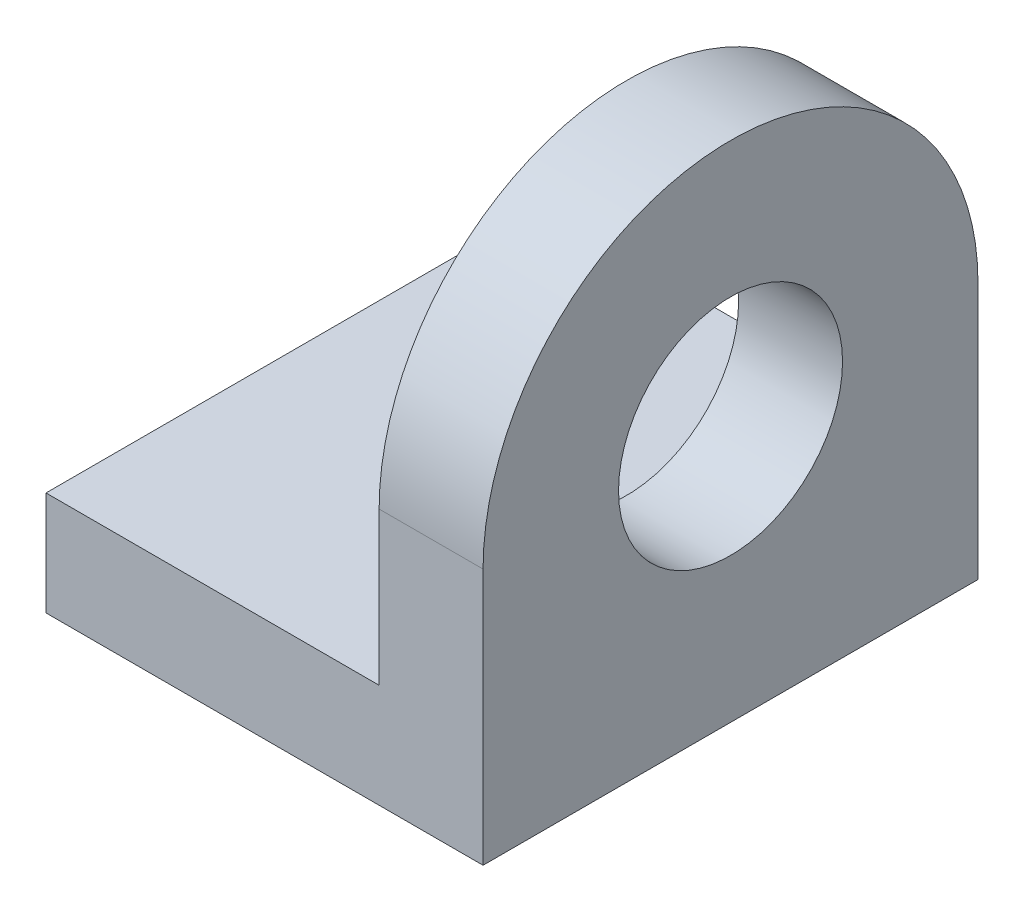
ISO-10303-21;
HEADER;
FILE_DESCRIPTION(('STEP AP214'),'2;1');
FILE_NAME('part.step','',(''),(''),'','','');
FILE_SCHEMA(('AUTOMOTIVE_DESIGN { 1 0 10303 214 1 1 1 1 }'));
ENDSEC;
DATA;
#1=APPLICATION_CONTEXT('core data for automotive mechanical design processes');
#2=APPLICATION_PROTOCOL_DEFINITION('international standard','automotive_design',2000,#1);
#3=PRODUCT_CONTEXT('',#1,'mechanical');
#4=PRODUCT('Part','Part','',(#3));
#5=PRODUCT_RELATED_PRODUCT_CATEGORY('part','',(#4));
#6=PRODUCT_DEFINITION_FORMATION('','',#4);
#7=PRODUCT_DEFINITION_CONTEXT('part definition',#1,'design');
#8=PRODUCT_DEFINITION('design','',#6,#7);
#9=PRODUCT_DEFINITION_SHAPE('','',#8);
#10=(LENGTH_UNIT() NAMED_UNIT(*) SI_UNIT(.MILLI.,.METRE.));
#11=(NAMED_UNIT(*) PLANE_ANGLE_UNIT() SI_UNIT($,.RADIAN.));
#12=(NAMED_UNIT(*) SI_UNIT($,.STERADIAN.) SOLID_ANGLE_UNIT());
#13=UNCERTAINTY_MEASURE_WITH_UNIT(LENGTH_MEASURE(1.E-05),#10,'distance_accuracy_value','');
#14=(GEOMETRIC_REPRESENTATION_CONTEXT(3) GLOBAL_UNCERTAINTY_ASSIGNED_CONTEXT((#13)) GLOBAL_UNIT_ASSIGNED_CONTEXT((#10,
#11,#12)) REPRESENTATION_CONTEXT('',''));
#15=CARTESIAN_POINT('',(0.,0.,0.));
#16=DIRECTION('',(0.,0.,1.));
#17=DIRECTION('',(1.,0.,0.));
#18=AXIS2_PLACEMENT_3D('',#15,#16,#17);
#19=CARTESIAN_POINT('',(-16.0260331578128,5.,-23.8101064058933));
#20=DIRECTION('',(1.,0.,0.));
#21=DIRECTION('',(0.,0.,-1.));
#22=AXIS2_PLACEMENT_3D('',#19,#20,#21);
#23=PLANE('',#22);
#24=DIRECTION('',(0.,0.,1.));
#25=VECTOR('',#24,1.);
#26=CARTESIAN_POINT('',(-16.0260331578128,0.,-23.8101064058933));
#27=LINE('',#26,#25);
#28=CARTESIAN_POINT('',(-16.0260331578128,0.,-23.8101064058933));
#29=VERTEX_POINT('',#28);
#30=CARTESIAN_POINT('',(-16.0260331578128,0.,0.));
#31=VERTEX_POINT('',#30);
#32=EDGE_CURVE('E99',#29,#31,#27,.T.);
#33=ORIENTED_EDGE('',*,*,#32,.T.);
#34=DIRECTION('',(0.,-1.,0.));
#35=VECTOR('',#34,1.);
#36=CARTESIAN_POINT('',(-16.0260331578128,5.,0.));
#37=LINE('',#36,#35);
#38=CARTESIAN_POINT('',(-16.0260331578128,5.,0.));
#39=VERTEX_POINT('',#38);
#40=EDGE_CURVE('E11',#39,#31,#37,.T.);
#41=ORIENTED_EDGE('',*,*,#40,.F.);
#42=DIRECTION('',(0.,0.,1.));
#43=VECTOR('',#42,1.);
#44=CARTESIAN_POINT('',(-16.0260331578128,5.,-23.8101064058933));
#45=LINE('',#44,#43);
#46=CARTESIAN_POINT('',(-16.0260331578128,5.,-23.8101064058933));
#47=VERTEX_POINT('',#46);
#48=EDGE_CURVE('E91',#47,#39,#45,.T.);
#49=ORIENTED_EDGE('',*,*,#48,.F.);
#50=DIRECTION('',(0.,-1.,0.));
#51=VECTOR('',#50,1.);
#52=CARTESIAN_POINT('',(-16.0260331578128,5.,-23.8101064058933));
#53=LINE('',#52,#51);
#54=EDGE_CURVE('E47',#47,#29,#53,.T.);
#55=ORIENTED_EDGE('',*,*,#54,.T.);
#56=EDGE_LOOP('',(#33,#41,#49,#55));
#57=FACE_BOUND('',#56,.T.);
#58=ADVANCED_FACE('F39',(#57),#23,.F.);
#59=CARTESIAN_POINT('',(-16.0260331578128,5.,0.));
#60=DIRECTION('',(0.,0.,-1.));
#61=DIRECTION('',(-1.,0.,0.));
#62=AXIS2_PLACEMENT_3D('',#59,#60,#61);
#63=PLANE('',#62);
#64=DIRECTION('',(1.,0.,0.));
#65=VECTOR('',#64,1.);
#66=CARTESIAN_POINT('',(-16.0260331578128,0.,0.));
#67=LINE('',#66,#65);
#68=CARTESIAN_POINT('',(5.,0.,0.));
#69=VERTEX_POINT('',#68);
#70=EDGE_CURVE('E68',#31,#69,#67,.T.);
#71=ORIENTED_EDGE('',*,*,#70,.T.);
#72=DIRECTION('',(0.,-1.,0.));
#73=VECTOR('',#72,1.);
#74=CARTESIAN_POINT('',(5.,0.,0.));
#75=LINE('',#74,#73);
#76=CARTESIAN_POINT('',(5.,12.3418394210588,0.));
#77=VERTEX_POINT('',#76);
#78=EDGE_CURVE('E112',#77,#69,#75,.T.);
#79=ORIENTED_EDGE('',*,*,#78,.F.);
#80=DIRECTION('',(-1.,0.,0.));
#81=VECTOR('',#80,1.);
#82=CARTESIAN_POINT('',(5.,12.3418394210588,0.));
#83=LINE('',#82,#81);
#84=CARTESIAN_POINT('',(0.,12.3418394210588,0.));
#85=VERTEX_POINT('',#84);
#86=EDGE_CURVE('E105',#77,#85,#83,.T.);
#87=ORIENTED_EDGE('',*,*,#86,.T.);
#88=DIRECTION('',(0.,-1.,0.));
#89=VECTOR('',#88,1.);
#90=CARTESIAN_POINT('',(0.,0.,0.));
#91=LINE('',#90,#89);
#92=CARTESIAN_POINT('',(0.,5.,0.));
#93=VERTEX_POINT('',#92);
#94=EDGE_CURVE('E90',#85,#93,#91,.T.);
#95=ORIENTED_EDGE('',*,*,#94,.T.);
#96=DIRECTION('',(1.,0.,0.));
#97=VECTOR('',#96,1.);
#98=CARTESIAN_POINT('',(-16.0260331578128,5.,0.));
#99=LINE('',#98,#97);
#100=EDGE_CURVE('E85',#39,#93,#99,.T.);
#101=ORIENTED_EDGE('',*,*,#100,.F.);
#102=ORIENTED_EDGE('',*,*,#40,.T.);
#103=EDGE_LOOP('',(#71,#79,#87,#95,#101,#102));
#104=FACE_BOUND('',#103,.T.);
#105=ADVANCED_FACE('F86',(#104),#63,.F.);
#106=CARTESIAN_POINT('',(-16.0260331578128,5.,-23.8101064058933));
#107=DIRECTION('',(0.,0.,1.));
#108=DIRECTION('',(1.,0.,0.));
#109=AXIS2_PLACEMENT_3D('',#106,#107,#108);
#110=PLANE('',#109);
#111=DIRECTION('',(-1.,0.,0.));
#112=VECTOR('',#111,1.);
#113=CARTESIAN_POINT('',(-16.0260331578128,0.,-23.8101064058933));
#114=LINE('',#113,#112);
#115=CARTESIAN_POINT('',(5.,0.,-23.8101064058933));
#116=VERTEX_POINT('',#115);
#117=EDGE_CURVE('E97',#116,#29,#114,.T.);
#118=ORIENTED_EDGE('',*,*,#117,.T.);
#119=ORIENTED_EDGE('',*,*,#54,.F.);
#120=DIRECTION('',(-1.,0.,0.));
#121=VECTOR('',#120,1.);
#122=CARTESIAN_POINT('',(-16.0260331578128,5.,-23.8101064058933));
#123=LINE('',#122,#121);
#124=CARTESIAN_POINT('',(0.,5.,-23.8101064058933));
#125=VERTEX_POINT('',#124);
#126=EDGE_CURVE('E55',#125,#47,#123,.T.);
#127=ORIENTED_EDGE('',*,*,#126,.F.);
#128=DIRECTION('',(0.,1.,0.));
#129=VECTOR('',#128,1.);
#130=CARTESIAN_POINT('',(0.,12.3418394210588,-23.8101064058933));
#131=LINE('',#130,#129);
#132=CARTESIAN_POINT('',(0.,12.3418394210588,-23.8101064058933));
#133=VERTEX_POINT('',#132);
#134=EDGE_CURVE('E118',#125,#133,#131,.T.);
#135=ORIENTED_EDGE('',*,*,#134,.T.);
#136=DIRECTION('',(-1.,0.,0.));
#137=VECTOR('',#136,1.);
#138=CARTESIAN_POINT('',(5.,12.3418394210588,-23.8101064058933));
#139=LINE('',#138,#137);
#140=CARTESIAN_POINT('',(5.,12.3418394210588,-23.8101064058933));
#141=VERTEX_POINT('',#140);
#142=EDGE_CURVE('E101',#141,#133,#139,.T.);
#143=ORIENTED_EDGE('',*,*,#142,.F.);
#144=DIRECTION('',(0.,1.,0.));
#145=VECTOR('',#144,1.);
#146=CARTESIAN_POINT('',(5.,12.3418394210588,-23.8101064058933));
#147=LINE('',#146,#145);
#148=EDGE_CURVE('E127',#116,#141,#147,.T.);
#149=ORIENTED_EDGE('',*,*,#148,.F.);
#150=EDGE_LOOP('',(#118,#119,#127,#135,#143,#149));
#151=FACE_BOUND('',#150,.T.);
#152=ADVANCED_FACE('F161',(#151),#110,.F.);
#153=CARTESIAN_POINT('',(0.,5.,0.));
#154=DIRECTION('',(0.,1.,0.));
#155=DIRECTION('',(0.,0.,1.));
#156=AXIS2_PLACEMENT_3D('',#153,#154,#155);
#157=PLANE('',#156);
#158=ORIENTED_EDGE('',*,*,#48,.T.);
#159=ORIENTED_EDGE('',*,*,#100,.T.);
#160=DIRECTION('',(0.,0.,-1.));
#161=VECTOR('',#160,1.);
#162=CARTESIAN_POINT('',(0.,5.,-23.8101064058933));
#163=LINE('',#162,#161);
#164=EDGE_CURVE('E75',#93,#125,#163,.T.);
#165=ORIENTED_EDGE('',*,*,#164,.T.);
#166=ORIENTED_EDGE('',*,*,#126,.T.);
#167=EDGE_LOOP('',(#158,#159,#165,#166));
#168=FACE_BOUND('',#167,.T.);
#169=ADVANCED_FACE('F94',(#168),#157,.T.);
#170=CARTESIAN_POINT('',(0.,0.,0.));
#171=DIRECTION('',(0.,1.,0.));
#172=DIRECTION('',(0.,0.,1.));
#173=AXIS2_PLACEMENT_3D('',#170,#171,#172);
#174=PLANE('',#173);
#175=ORIENTED_EDGE('',*,*,#32,.F.);
#176=ORIENTED_EDGE('',*,*,#117,.F.);
#177=DIRECTION('',(0.,0.,-1.));
#178=VECTOR('',#177,1.);
#179=CARTESIAN_POINT('',(5.,0.,-23.8101064058933));
#180=LINE('',#179,#178);
#181=EDGE_CURVE('E114',#69,#116,#180,.T.);
#182=ORIENTED_EDGE('',*,*,#181,.F.);
#183=ORIENTED_EDGE('',*,*,#70,.F.);
#184=EDGE_LOOP('',(#175,#176,#182,#183));
#185=FACE_BOUND('',#184,.T.);
#186=ADVANCED_FACE('F153',(#185),#174,.F.);
#187=CARTESIAN_POINT('',(0.,12.3418394210588,-11.9050532029466));
#188=DIRECTION('',(-1.,0.,0.));
#189=DIRECTION('',(0.,0.,1.));
#190=AXIS2_PLACEMENT_3D('',#187,#188,#189);
#191=PLANE('',#190);
#192=CARTESIAN_POINT('',(0.,12.3418394210588,-11.9050532029466));
#193=DIRECTION('',(1.,0.,0.));
#194=DIRECTION('',(0.,0.,-1.));
#195=AXIS2_PLACEMENT_3D('',#192,#193,#194);
#196=CIRCLE('',#195,5.38855883816069);
#197=CARTESIAN_POINT('',(0.,12.3418394210588,-17.2936120411073));
#198=VERTEX_POINT('',#197);
#199=EDGE_CURVE('E132',#198,#198,#196,.T.);
#200=ORIENTED_EDGE('',*,*,#199,.T.);
#201=EDGE_LOOP('',(#200));
#202=FACE_BOUND('',#201,.T.);
#203=ORIENTED_EDGE('',*,*,#164,.F.);
#204=ORIENTED_EDGE('',*,*,#94,.F.);
#205=CARTESIAN_POINT('',(0.,12.3418394210588,-11.9050532029466));
#206=DIRECTION('',(1.,0.,0.));
#207=DIRECTION('',(0.,0.,1.));
#208=AXIS2_PLACEMENT_3D('',#205,#206,#207);
#209=CIRCLE('',#208,11.9050532029466);
#210=EDGE_CURVE('E115',#133,#85,#209,.T.);
#211=ORIENTED_EDGE('',*,*,#210,.F.);
#212=ORIENTED_EDGE('',*,*,#134,.F.);
#213=EDGE_LOOP('',(#203,#204,#211,#212));
#214=FACE_BOUND('',#213,.T.);
#215=ADVANCED_FACE('F144',(#202,#214),#191,.T.);
#216=CARTESIAN_POINT('',(5.,12.3418394210588,-11.9050532029466));
#217=DIRECTION('',(-1.,0.,0.));
#218=DIRECTION('',(0.,0.,1.));
#219=AXIS2_PLACEMENT_3D('',#216,#217,#218);
#220=PLANE('',#219);
#221=ORIENTED_EDGE('',*,*,#181,.T.);
#222=ORIENTED_EDGE('',*,*,#148,.T.);
#223=CARTESIAN_POINT('',(5.,12.3418394210588,-11.9050532029466));
#224=DIRECTION('',(1.,0.,0.));
#225=DIRECTION('',(0.,0.,1.));
#226=AXIS2_PLACEMENT_3D('',#223,#224,#225);
#227=CIRCLE('',#226,11.9050532029466);
#228=EDGE_CURVE('E124',#141,#77,#227,.T.);
#229=ORIENTED_EDGE('',*,*,#228,.T.);
#230=ORIENTED_EDGE('',*,*,#78,.T.);
#231=EDGE_LOOP('',(#221,#222,#229,#230));
#232=FACE_BOUND('',#231,.T.);
#233=CARTESIAN_POINT('',(5.,12.3418394210588,-11.9050532029466));
#234=DIRECTION('',(1.,0.,0.));
#235=DIRECTION('',(0.,0.,-1.));
#236=AXIS2_PLACEMENT_3D('',#233,#234,#235);
#237=CIRCLE('',#236,5.38855883816069);
#238=CARTESIAN_POINT('',(5.,12.3418394210588,-17.2936120411073));
#239=VERTEX_POINT('',#238);
#240=EDGE_CURVE('E121',#239,#239,#237,.T.);
#241=ORIENTED_EDGE('',*,*,#240,.F.);
#242=EDGE_LOOP('',(#241));
#243=FACE_BOUND('',#242,.T.);
#244=ADVANCED_FACE('F141',(#232,#243),#220,.F.);
#245=CARTESIAN_POINT('',(5.,12.3418394210588,-11.9050532029466));
#246=DIRECTION('',(-1.,0.,0.));
#247=DIRECTION('',(0.,0.,1.));
#248=AXIS2_PLACEMENT_3D('',#245,#246,#247);
#249=CYLINDRICAL_SURFACE('',#248,11.9050532029466);
#250=ORIENTED_EDGE('',*,*,#210,.T.);
#251=ORIENTED_EDGE('',*,*,#86,.F.);
#252=ORIENTED_EDGE('',*,*,#228,.F.);
#253=ORIENTED_EDGE('',*,*,#142,.T.);
#254=EDGE_LOOP('',(#250,#251,#252,#253));
#255=FACE_BOUND('',#254,.T.);
#256=ADVANCED_FACE('F143',(#255),#249,.T.);
#257=CARTESIAN_POINT('',(5.,12.3418394210588,-11.9050532029466));
#258=DIRECTION('',(-1.,0.,0.));
#259=DIRECTION('',(0.,0.,1.));
#260=AXIS2_PLACEMENT_3D('',#257,#258,#259);
#261=CYLINDRICAL_SURFACE('',#260,5.38855883816069);
#262=ORIENTED_EDGE('',*,*,#240,.T.);
#263=EDGE_LOOP('',(#262));
#264=FACE_BOUND('',#263,.T.);
#265=ORIENTED_EDGE('',*,*,#199,.F.);
#266=EDGE_LOOP('',(#265));
#267=FACE_BOUND('',#266,.T.);
#268=ADVANCED_FACE('F138',(#264,#267),#261,.F.);
#269=CLOSED_SHELL('',(#58,#105,#152,#169,#186,#215,#244,#256,#268));
#270=MANIFOLD_SOLID_BREP('B2',#269);
#271=ADVANCED_BREP_SHAPE_REPRESENTATION('',(#18,#270),#14);
#272=SHAPE_DEFINITION_REPRESENTATION(#9,#271);
ENDSEC;
END-ISO-10303-21;
